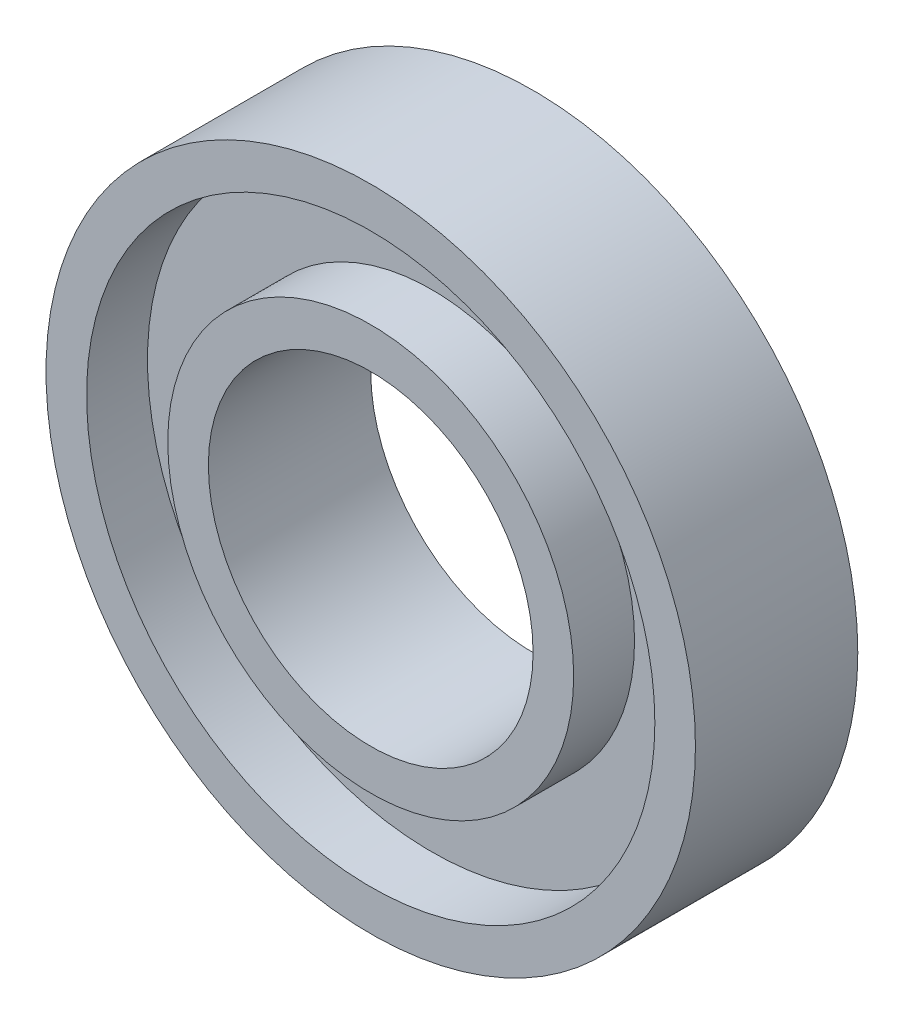
ISO-10303-21;
HEADER;
FILE_DESCRIPTION(('STEP AP214'),'2;1');
FILE_NAME('part.step','',(''),(''),'','','');
FILE_SCHEMA(('AUTOMOTIVE_DESIGN { 1 0 10303 214 1 1 1 1 }'));
ENDSEC;
DATA;
#1=APPLICATION_CONTEXT('core data for automotive mechanical design processes');
#2=APPLICATION_PROTOCOL_DEFINITION('international standard','automotive_design',2000,#1);
#3=PRODUCT_CONTEXT('',#1,'mechanical');
#4=PRODUCT('Part','Part','',(#3));
#5=PRODUCT_RELATED_PRODUCT_CATEGORY('part','',(#4));
#6=PRODUCT_DEFINITION_FORMATION('','',#4);
#7=PRODUCT_DEFINITION_CONTEXT('part definition',#1,'design');
#8=PRODUCT_DEFINITION('design','',#6,#7);
#9=PRODUCT_DEFINITION_SHAPE('','',#8);
#10=(LENGTH_UNIT() NAMED_UNIT(*) SI_UNIT(.MILLI.,.METRE.));
#11=(NAMED_UNIT(*) PLANE_ANGLE_UNIT() SI_UNIT($,.RADIAN.));
#12=(NAMED_UNIT(*) SI_UNIT($,.STERADIAN.) SOLID_ANGLE_UNIT());
#13=UNCERTAINTY_MEASURE_WITH_UNIT(LENGTH_MEASURE(1.E-05),#10,'distance_accuracy_value','');
#14=(GEOMETRIC_REPRESENTATION_CONTEXT(3) GLOBAL_UNCERTAINTY_ASSIGNED_CONTEXT((#13)) GLOBAL_UNIT_ASSIGNED_CONTEXT((#10,
#11,#12)) REPRESENTATION_CONTEXT('',''));
#15=CARTESIAN_POINT('',(0.,0.,0.));
#16=DIRECTION('',(0.,0.,1.));
#17=DIRECTION('',(1.,0.,0.));
#18=AXIS2_PLACEMENT_3D('',#15,#16,#17);
#19=CARTESIAN_POINT('',(0.,0.,0.));
#20=DIRECTION('',(0.,0.,1.));
#21=DIRECTION('',(1.,0.,0.));
#22=AXIS2_PLACEMENT_3D('',#19,#20,#21);
#23=PLANE('',#22);
#24=CARTESIAN_POINT('',(0.,0.,0.));
#25=DIRECTION('',(0.,0.,1.));
#26=DIRECTION('',(1.,0.,0.));
#27=AXIS2_PLACEMENT_3D('',#24,#25,#26);
#28=CIRCLE('',#27,4.);
#29=CARTESIAN_POINT('',(4.,0.,0.));
#30=VERTEX_POINT('',#29);
#31=EDGE_CURVE('E50',#30,#30,#28,.T.);
#32=ORIENTED_EDGE('',*,*,#31,.T.);
#33=EDGE_LOOP('',(#32));
#34=FACE_BOUND('',#33,.T.);
#35=CARTESIAN_POINT('',(0.,0.,0.));
#36=DIRECTION('',(0.,0.,1.));
#37=DIRECTION('',(1.,0.,0.));
#38=AXIS2_PLACEMENT_3D('',#35,#36,#37);
#39=CIRCLE('',#38,5.);
#40=CARTESIAN_POINT('',(5.,0.,0.));
#41=VERTEX_POINT('',#40);
#42=EDGE_CURVE('E74',#41,#41,#39,.T.);
#43=ORIENTED_EDGE('',*,*,#42,.F.);
#44=EDGE_LOOP('',(#43));
#45=FACE_BOUND('',#44,.T.);
#46=ADVANCED_FACE('F37',(#34,#45),#23,.F.);
#47=CARTESIAN_POINT('',(0.,0.,4.));
#48=DIRECTION('',(0.,0.,1.));
#49=DIRECTION('',(1.,0.,0.));
#50=AXIS2_PLACEMENT_3D('',#47,#48,#49);
#51=PLANE('',#50);
#52=CARTESIAN_POINT('',(0.,0.,4.));
#53=DIRECTION('',(0.,0.,1.));
#54=DIRECTION('',(1.,0.,0.));
#55=AXIS2_PLACEMENT_3D('',#52,#53,#54);
#56=CIRCLE('',#55,4.);
#57=CARTESIAN_POINT('',(4.,0.,4.));
#58=VERTEX_POINT('',#57);
#59=EDGE_CURVE('E48',#58,#58,#56,.T.);
#60=ORIENTED_EDGE('',*,*,#59,.F.);
#61=EDGE_LOOP('',(#60));
#62=FACE_BOUND('',#61,.T.);
#63=CARTESIAN_POINT('',(0.,0.,4.));
#64=DIRECTION('',(0.,0.,1.));
#65=DIRECTION('',(1.,0.,0.));
#66=AXIS2_PLACEMENT_3D('',#63,#64,#65);
#67=CIRCLE('',#66,5.);
#68=CARTESIAN_POINT('',(5.,0.,4.));
#69=VERTEX_POINT('',#68);
#70=EDGE_CURVE('E62',#69,#69,#67,.T.);
#71=ORIENTED_EDGE('',*,*,#70,.T.);
#72=EDGE_LOOP('',(#71));
#73=FACE_BOUND('',#72,.T.);
#74=ADVANCED_FACE('F90',(#62,#73),#51,.T.);
#75=CARTESIAN_POINT('',(0.,0.,4.));
#76=DIRECTION('',(0.,0.,1.));
#77=DIRECTION('',(1.,0.,0.));
#78=AXIS2_PLACEMENT_3D('',#75,#76,#77);
#79=CIRCLE('',#78,7.);
#80=CARTESIAN_POINT('',(7.,0.,4.));
#81=VERTEX_POINT('',#80);
#82=EDGE_CURVE('E56',#81,#81,#79,.T.);
#83=ORIENTED_EDGE('',*,*,#82,.F.);
#84=EDGE_LOOP('',(#83));
#85=FACE_BOUND('',#84,.T.);
#86=CARTESIAN_POINT('',(0.,0.,4.));
#87=DIRECTION('',(0.,0.,1.));
#88=DIRECTION('',(1.,0.,0.));
#89=AXIS2_PLACEMENT_3D('',#86,#87,#88);
#90=CIRCLE('',#89,8.);
#91=CARTESIAN_POINT('',(8.,0.,4.));
#92=VERTEX_POINT('',#91);
#93=EDGE_CURVE('E10',#92,#92,#90,.T.);
#94=ORIENTED_EDGE('',*,*,#93,.T.);
#95=EDGE_LOOP('',(#94));
#96=FACE_BOUND('',#95,.T.);
#97=ADVANCED_FACE('F98',(#85,#96),#51,.T.);
#98=CARTESIAN_POINT('',(0.,0.,0.));
#99=DIRECTION('',(0.,0.,1.));
#100=DIRECTION('',(1.,0.,0.));
#101=AXIS2_PLACEMENT_3D('',#98,#99,#100);
#102=CIRCLE('',#101,7.);
#103=CARTESIAN_POINT('',(7.,0.,0.));
#104=VERTEX_POINT('',#103);
#105=EDGE_CURVE('E68',#104,#104,#102,.T.);
#106=ORIENTED_EDGE('',*,*,#105,.T.);
#107=EDGE_LOOP('',(#106));
#108=FACE_BOUND('',#107,.T.);
#109=CARTESIAN_POINT('',(0.,0.,0.));
#110=DIRECTION('',(0.,0.,1.));
#111=DIRECTION('',(1.,0.,0.));
#112=AXIS2_PLACEMENT_3D('',#109,#110,#111);
#113=CIRCLE('',#112,8.);
#114=CARTESIAN_POINT('',(8.,0.,0.));
#115=VERTEX_POINT('',#114);
#116=EDGE_CURVE('E41',#115,#115,#113,.T.);
#117=ORIENTED_EDGE('',*,*,#116,.F.);
#118=EDGE_LOOP('',(#117));
#119=FACE_BOUND('',#118,.T.);
#120=ADVANCED_FACE('F92',(#108,#119),#23,.F.);
#121=CARTESIAN_POINT('',(0.,0.,4.));
#122=DIRECTION('',(0.,0.,-1.));
#123=DIRECTION('',(-1.,0.,0.));
#124=AXIS2_PLACEMENT_3D('',#121,#122,#123);
#125=CYLINDRICAL_SURFACE('',#124,8.);
#126=ORIENTED_EDGE('',*,*,#93,.F.);
#127=EDGE_LOOP('',(#126));
#128=FACE_BOUND('',#127,.T.);
#129=ORIENTED_EDGE('',*,*,#116,.T.);
#130=EDGE_LOOP('',(#129));
#131=FACE_BOUND('',#130,.T.);
#132=ADVANCED_FACE('F39',(#128,#131),#125,.T.);
#133=CARTESIAN_POINT('',(0.,0.,4.));
#134=DIRECTION('',(0.,0.,-1.));
#135=DIRECTION('',(-1.,0.,0.));
#136=AXIS2_PLACEMENT_3D('',#133,#134,#135);
#137=CYLINDRICAL_SURFACE('',#136,4.);
#138=ORIENTED_EDGE('',*,*,#59,.T.);
#139=EDGE_LOOP('',(#138));
#140=FACE_BOUND('',#139,.T.);
#141=ORIENTED_EDGE('',*,*,#31,.F.);
#142=EDGE_LOOP('',(#141));
#143=FACE_BOUND('',#142,.T.);
#144=ADVANCED_FACE('F106',(#140,#143),#137,.F.);
#145=CARTESIAN_POINT('',(0.,0.,2.5));
#146=DIRECTION('',(0.,0.,1.));
#147=DIRECTION('',(1.,0.,0.));
#148=AXIS2_PLACEMENT_3D('',#145,#146,#147);
#149=CYLINDRICAL_SURFACE('',#148,7.);
#150=CARTESIAN_POINT('',(0.,0.,2.5));
#151=DIRECTION('',(0.,0.,1.));
#152=DIRECTION('',(1.,0.,0.));
#153=AXIS2_PLACEMENT_3D('',#150,#151,#152);
#154=CIRCLE('',#153,7.);
#155=CARTESIAN_POINT('',(7.,0.,2.5));
#156=VERTEX_POINT('',#155);
#157=EDGE_CURVE('E53',#156,#156,#154,.T.);
#158=ORIENTED_EDGE('',*,*,#157,.F.);
#159=EDGE_LOOP('',(#158));
#160=FACE_BOUND('',#159,.T.);
#161=ORIENTED_EDGE('',*,*,#82,.T.);
#162=EDGE_LOOP('',(#161));
#163=FACE_BOUND('',#162,.T.);
#164=ADVANCED_FACE('F129',(#160,#163),#149,.F.);
#165=CARTESIAN_POINT('',(0.,0.,2.5));
#166=DIRECTION('',(0.,0.,1.));
#167=DIRECTION('',(1.,0.,0.));
#168=AXIS2_PLACEMENT_3D('',#165,#166,#167);
#169=PLANE('',#168);
#170=CARTESIAN_POINT('',(0.,0.,2.5));
#171=DIRECTION('',(0.,0.,1.));
#172=DIRECTION('',(1.,0.,0.));
#173=AXIS2_PLACEMENT_3D('',#170,#171,#172);
#174=CIRCLE('',#173,5.);
#175=CARTESIAN_POINT('',(5.,0.,2.5));
#176=VERTEX_POINT('',#175);
#177=EDGE_CURVE('E59',#176,#176,#174,.T.);
#178=ORIENTED_EDGE('',*,*,#177,.F.);
#179=EDGE_LOOP('',(#178));
#180=FACE_BOUND('',#179,.T.);
#181=ORIENTED_EDGE('',*,*,#157,.T.);
#182=EDGE_LOOP('',(#181));
#183=FACE_BOUND('',#182,.T.);
#184=ADVANCED_FACE('F125',(#180,#183),#169,.T.);
#185=CARTESIAN_POINT('',(0.,0.,2.5));
#186=DIRECTION('',(0.,0.,1.));
#187=DIRECTION('',(1.,0.,0.));
#188=AXIS2_PLACEMENT_3D('',#185,#186,#187);
#189=CYLINDRICAL_SURFACE('',#188,5.);
#190=ORIENTED_EDGE('',*,*,#177,.T.);
#191=EDGE_LOOP('',(#190));
#192=FACE_BOUND('',#191,.T.);
#193=ORIENTED_EDGE('',*,*,#70,.F.);
#194=EDGE_LOOP('',(#193));
#195=FACE_BOUND('',#194,.T.);
#196=ADVANCED_FACE('F120',(#192,#195),#189,.T.);
#197=CARTESIAN_POINT('',(0.,0.,1.5));
#198=DIRECTION('',(0.,0.,-1.));
#199=DIRECTION('',(1.,0.,0.));
#200=AXIS2_PLACEMENT_3D('',#197,#198,#199);
#201=PLANE('',#200);
#202=CARTESIAN_POINT('',(0.,0.,1.5));
#203=DIRECTION('',(0.,0.,1.));
#204=DIRECTION('',(1.,0.,0.));
#205=AXIS2_PLACEMENT_3D('',#202,#203,#204);
#206=CIRCLE('',#205,7.);
#207=CARTESIAN_POINT('',(7.,0.,1.5));
#208=VERTEX_POINT('',#207);
#209=EDGE_CURVE('E65',#208,#208,#206,.T.);
#210=ORIENTED_EDGE('',*,*,#209,.F.);
#211=EDGE_LOOP('',(#210));
#212=FACE_BOUND('',#211,.T.);
#213=CARTESIAN_POINT('',(0.,0.,1.5));
#214=DIRECTION('',(0.,0.,1.));
#215=DIRECTION('',(1.,0.,0.));
#216=AXIS2_PLACEMENT_3D('',#213,#214,#215);
#217=CIRCLE('',#216,5.);
#218=CARTESIAN_POINT('',(5.,0.,1.5));
#219=VERTEX_POINT('',#218);
#220=EDGE_CURVE('E71',#219,#219,#217,.T.);
#221=ORIENTED_EDGE('',*,*,#220,.T.);
#222=EDGE_LOOP('',(#221));
#223=FACE_BOUND('',#222,.T.);
#224=ADVANCED_FACE('F80',(#212,#223),#201,.T.);
#225=CARTESIAN_POINT('',(0.,0.,1.5));
#226=DIRECTION('',(0.,0.,-1.));
#227=DIRECTION('',(-1.,0.,0.));
#228=AXIS2_PLACEMENT_3D('',#225,#226,#227);
#229=CYLINDRICAL_SURFACE('',#228,7.);
#230=ORIENTED_EDGE('',*,*,#209,.T.);
#231=EDGE_LOOP('',(#230));
#232=FACE_BOUND('',#231,.T.);
#233=ORIENTED_EDGE('',*,*,#105,.F.);
#234=EDGE_LOOP('',(#233));
#235=FACE_BOUND('',#234,.T.);
#236=ADVANCED_FACE('F85',(#232,#235),#229,.F.);
#237=CARTESIAN_POINT('',(0.,0.,1.5));
#238=DIRECTION('',(0.,0.,-1.));
#239=DIRECTION('',(-1.,0.,0.));
#240=AXIS2_PLACEMENT_3D('',#237,#238,#239);
#241=CYLINDRICAL_SURFACE('',#240,5.);
#242=ORIENTED_EDGE('',*,*,#220,.F.);
#243=EDGE_LOOP('',(#242));
#244=FACE_BOUND('',#243,.T.);
#245=ORIENTED_EDGE('',*,*,#42,.T.);
#246=EDGE_LOOP('',(#245));
#247=FACE_BOUND('',#246,.T.);
#248=ADVANCED_FACE('F82',(#244,#247),#241,.T.);
#249=CLOSED_SHELL('',(#46,#74,#97,#120,#132,#144,#164,#184,#196,#224,#236,#248));
#250=MANIFOLD_SOLID_BREP('B2',#249);
#251=ADVANCED_BREP_SHAPE_REPRESENTATION('',(#18,#250),#14);
#252=SHAPE_DEFINITION_REPRESENTATION(#9,#251);
ENDSEC;
END-ISO-10303-21;
